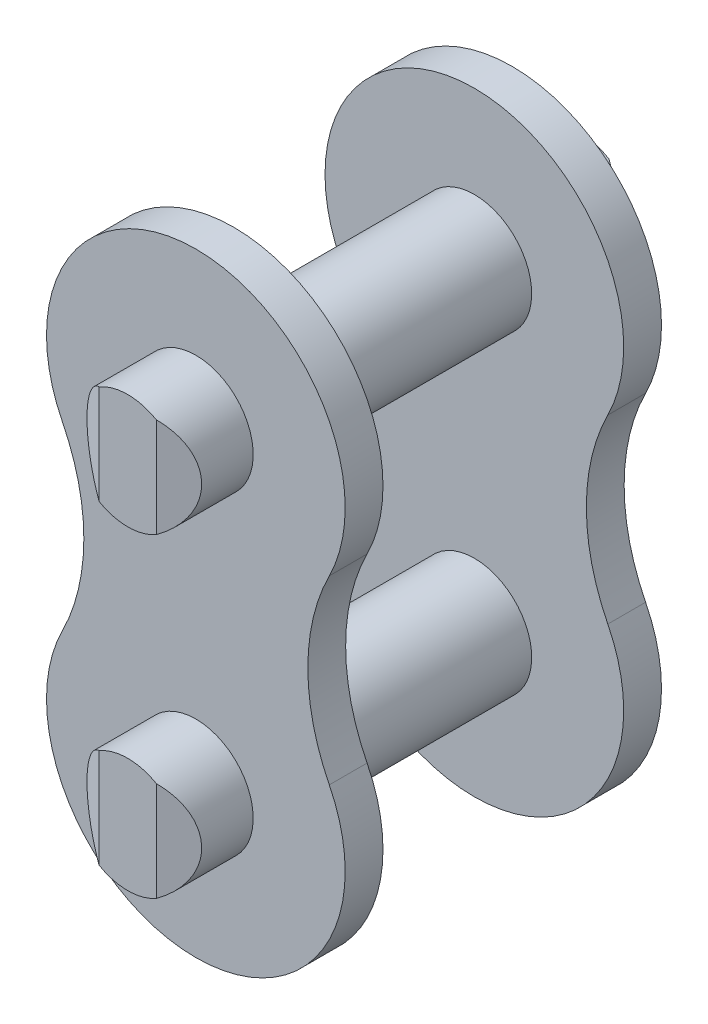
ISO-10303-21;
HEADER;
FILE_DESCRIPTION(('STEP AP214'),'2;1');
FILE_NAME('part.step','',(''),(''),'','','');
FILE_SCHEMA(('AUTOMOTIVE_DESIGN { 1 0 10303 214 1 1 1 1 }'));
ENDSEC;
DATA;
#1=APPLICATION_CONTEXT('core data for automotive mechanical design processes');
#2=APPLICATION_PROTOCOL_DEFINITION('international standard','automotive_design',2000,#1);
#3=PRODUCT_CONTEXT('',#1,'mechanical');
#4=PRODUCT('Part','Part','',(#3));
#5=PRODUCT_RELATED_PRODUCT_CATEGORY('part','',(#4));
#6=PRODUCT_DEFINITION_FORMATION('','',#4);
#7=PRODUCT_DEFINITION_CONTEXT('part definition',#1,'design');
#8=PRODUCT_DEFINITION('design','',#6,#7);
#9=PRODUCT_DEFINITION_SHAPE('','',#8);
#10=(LENGTH_UNIT() NAMED_UNIT(*) SI_UNIT(.MILLI.,.METRE.));
#11=(NAMED_UNIT(*) PLANE_ANGLE_UNIT() SI_UNIT($,.RADIAN.));
#12=(NAMED_UNIT(*) SI_UNIT($,.STERADIAN.) SOLID_ANGLE_UNIT());
#13=UNCERTAINTY_MEASURE_WITH_UNIT(LENGTH_MEASURE(1.E-05),#10,'distance_accuracy_value','');
#14=(GEOMETRIC_REPRESENTATION_CONTEXT(3) GLOBAL_UNCERTAINTY_ASSIGNED_CONTEXT((#13)) GLOBAL_UNIT_ASSIGNED_CONTEXT((#10,
#11,#12)) REPRESENTATION_CONTEXT('',''));
#15=CARTESIAN_POINT('',(0.,0.,0.));
#16=DIRECTION('',(0.,0.,1.));
#17=DIRECTION('',(1.,0.,0.));
#18=AXIS2_PLACEMENT_3D('',#15,#16,#17);
#19=CARTESIAN_POINT('',(81.9245250000065,299.467152986134,-131.392489073474));
#20=DIRECTION('',(0.5,0.,0.866025403784439));
#21=DIRECTION('',(0.,-1.,0.));
#22=AXIS2_PLACEMENT_3D('',#19,#20,#21);
#23=PLANE('',#22);
#24=CARTESIAN_POINT('',(82.7913000000066,313.969811837083,-131.892921853051));
#25=DIRECTION('',(-0.5,0.,-0.866025403784439));
#26=DIRECTION('',(-0.866025403784439,0.,0.5));
#27=AXIS2_PLACEMENT_3D('',#24,#25,#26);
#28=ELLIPSE('',#27,1.3344874122049,1.1557);
#29=CARTESIAN_POINT('',(82.2134500000065,312.968946277929,-131.5593));
#30=VERTEX_POINT('',#29);
#31=CARTESIAN_POINT('',(82.2134500000066,314.970677396236,-131.5593));
#32=VERTEX_POINT('',#31);
#33=EDGE_CURVE('E225',#30,#32,#28,.T.);
#34=ORIENTED_EDGE('',*,*,#33,.T.);
#35=DIRECTION('',(0.,1.,0.));
#36=VECTOR('',#35,1.);
#37=CARTESIAN_POINT('',(82.2134500000065,299.467152986134,-131.5593));
#38=LINE('',#37,#36);
#39=EDGE_CURVE('E206',#30,#32,#38,.T.);
#40=ORIENTED_EDGE('',*,*,#39,.F.);
#41=EDGE_LOOP('',(#34,#40));
#42=FACE_BOUND('',#41,.T.);
#43=ADVANCED_FACE('F17',(#42),#23,.F.);
#44=CARTESIAN_POINT('',(83.6580750000065,299.467152986134,-131.392489073474));
#45=DIRECTION('',(0.5,0.,-0.866025403784439));
#46=DIRECTION('',(0.,-1.,0.));
#47=AXIS2_PLACEMENT_3D('',#44,#45,#46);
#48=PLANE('',#47);
#49=CARTESIAN_POINT('',(82.7913000000066,313.969811837083,-131.892921853051));
#50=DIRECTION('',(-0.5,0.,0.866025403784439));
#51=DIRECTION('',(0.866025403784439,0.,0.5));
#52=AXIS2_PLACEMENT_3D('',#49,#50,#51);
#53=ELLIPSE('',#52,1.3344874122049,1.1557);
#54=CARTESIAN_POINT('',(83.3691500000066,312.968946277929,-131.5593));
#55=VERTEX_POINT('',#54);
#56=CARTESIAN_POINT('',(83.3691500000066,314.970677396236,-131.5593));
#57=VERTEX_POINT('',#56);
#58=EDGE_CURVE('E200',#55,#57,#53,.T.);
#59=ORIENTED_EDGE('',*,*,#58,.F.);
#60=DIRECTION('',(0.,1.,0.));
#61=VECTOR('',#60,1.);
#62=CARTESIAN_POINT('',(83.3691500000065,299.467152986134,-131.5593));
#63=LINE('',#62,#61);
#64=EDGE_CURVE('E197',#55,#57,#63,.T.);
#65=ORIENTED_EDGE('',*,*,#64,.T.);
#66=EDGE_LOOP('',(#59,#65));
#67=FACE_BOUND('',#66,.T.);
#68=ADVANCED_FACE('F19',(#67),#48,.T.);
#69=CARTESIAN_POINT('',(81.9245250000065,299.467152986134,-131.392489073474));
#70=DIRECTION('',(0.5,0.,0.866025403784439));
#71=DIRECTION('',(0.,-1.,0.));
#72=AXIS2_PLACEMENT_3D('',#69,#70,#71);
#73=PLANE('',#72);
#74=CARTESIAN_POINT('',(82.7913000000066,320.319811837083,-131.892921853051));
#75=DIRECTION('',(-0.5,0.,-0.866025403784439));
#76=DIRECTION('',(-0.866025403784439,0.,0.5));
#77=AXIS2_PLACEMENT_3D('',#74,#75,#76);
#78=ELLIPSE('',#77,1.3344874122049,1.1557);
#79=CARTESIAN_POINT('',(82.2134500000066,319.318946277929,-131.5593));
#80=VERTEX_POINT('',#79);
#81=CARTESIAN_POINT('',(82.2134500000066,321.320677396236,-131.5593));
#82=VERTEX_POINT('',#81);
#83=EDGE_CURVE('E230',#80,#82,#78,.T.);
#84=ORIENTED_EDGE('',*,*,#83,.T.);
#85=DIRECTION('',(0.,1.,0.));
#86=VECTOR('',#85,1.);
#87=CARTESIAN_POINT('',(82.2134500000065,299.467152986134,-131.5593));
#88=LINE('',#87,#86);
#89=EDGE_CURVE('E239',#80,#82,#88,.T.);
#90=ORIENTED_EDGE('',*,*,#89,.F.);
#91=EDGE_LOOP('',(#84,#90));
#92=FACE_BOUND('',#91,.T.);
#93=ADVANCED_FACE('F413',(#92),#73,.F.);
#94=CARTESIAN_POINT('',(83.6580750000065,299.467152986134,-131.392489073474));
#95=DIRECTION('',(0.5,0.,-0.866025403784439));
#96=DIRECTION('',(0.,-1.,0.));
#97=AXIS2_PLACEMENT_3D('',#94,#95,#96);
#98=PLANE('',#97);
#99=CARTESIAN_POINT('',(82.7913000000066,320.319811837083,-131.892921853051));
#100=DIRECTION('',(-0.5,0.,0.866025403784439));
#101=DIRECTION('',(0.866025403784439,0.,0.5));
#102=AXIS2_PLACEMENT_3D('',#99,#100,#101);
#103=ELLIPSE('',#102,1.3344874122049,1.1557);
#104=CARTESIAN_POINT('',(83.3691500000066,319.318946277929,-131.5593));
#105=VERTEX_POINT('',#104);
#106=CARTESIAN_POINT('',(83.3691500000066,321.320677396236,-131.5593));
#107=VERTEX_POINT('',#106);
#108=EDGE_CURVE('E252',#105,#107,#103,.T.);
#109=ORIENTED_EDGE('',*,*,#108,.F.);
#110=DIRECTION('',(0.,1.,0.));
#111=VECTOR('',#110,1.);
#112=CARTESIAN_POINT('',(83.3691500000065,299.467152986134,-131.5593));
#113=LINE('',#112,#111);
#114=EDGE_CURVE('E236',#105,#107,#113,.T.);
#115=ORIENTED_EDGE('',*,*,#114,.T.);
#116=EDGE_LOOP('',(#109,#115));
#117=FACE_BOUND('',#116,.T.);
#118=ADVANCED_FACE('F411',(#117),#98,.T.);
#119=CARTESIAN_POINT('',(82.7913000000066,317.144811837083,-129.4257));
#120=DIRECTION('',(0.,0.,-1.));
#121=DIRECTION('',(0.,-1.,0.));
#122=AXIS2_PLACEMENT_3D('',#119,#120,#121);
#123=PLANE('',#122);
#124=CARTESIAN_POINT('',(82.7913000000066,313.969811837083,-129.4257));
#125=DIRECTION('',(0.,0.,1.));
#126=DIRECTION('',(0.,1.,0.));
#127=AXIS2_PLACEMENT_3D('',#124,#125,#126);
#128=CIRCLE('',#127,1.1557);
#129=CARTESIAN_POINT('',(82.7913000000066,315.125511837082,-129.4257));
#130=VERTEX_POINT('',#129);
#131=EDGE_CURVE('E319',#130,#130,#128,.T.);
#132=ORIENTED_EDGE('',*,*,#131,.F.);
#133=EDGE_LOOP('',(#132));
#134=FACE_BOUND('',#133,.T.);
#135=CARTESIAN_POINT('',(82.7913000000066,320.319811837083,-129.4257));
#136=DIRECTION('',(0.,0.,1.));
#137=DIRECTION('',(0.,1.,0.));
#138=AXIS2_PLACEMENT_3D('',#135,#136,#137);
#139=CIRCLE('',#138,1.1557);
#140=CARTESIAN_POINT('',(82.7913000000066,321.475511837083,-129.4257));
#141=VERTEX_POINT('',#140);
#142=EDGE_CURVE('E394',#141,#141,#139,.T.);
#143=ORIENTED_EDGE('',*,*,#142,.F.);
#144=EDGE_LOOP('',(#143));
#145=FACE_BOUND('',#144,.T.);
#146=CARTESIAN_POINT('',(89.1133747362935,317.144811837083,-129.4257));
#147=DIRECTION('',(0.,0.,1.));
#148=DIRECTION('',(0.,1.,0.));
#149=AXIS2_PLACEMENT_3D('',#146,#147,#148);
#150=CIRCLE('',#149,4.06464973628698);
#151=CARTESIAN_POINT('',(85.4810560209653,318.968993360115,-129.4257));
#152=VERTEX_POINT('',#151);
#153=CARTESIAN_POINT('',(85.4810560209653,315.32063031405,-129.4257));
#154=VERTEX_POINT('',#153);
#155=EDGE_CURVE('E238',#152,#154,#150,.T.);
#156=ORIENTED_EDGE('',*,*,#155,.F.);
#157=CARTESIAN_POINT('',(82.7913000000066,320.319811837083,-129.4257));
#158=DIRECTION('',(0.,0.,1.));
#159=DIRECTION('',(0.,1.,0.));
#160=AXIS2_PLACEMENT_3D('',#157,#158,#159);
#161=CIRCLE('',#160,3.0099);
#162=CARTESIAN_POINT('',(80.1015439790478,318.968993360115,-129.4257));
#163=VERTEX_POINT('',#162);
#164=EDGE_CURVE('E247',#152,#163,#161,.T.);
#165=ORIENTED_EDGE('',*,*,#164,.T.);
#166=CARTESIAN_POINT('',(76.4692252637197,317.144811837083,-129.4257));
#167=DIRECTION('',(0.,0.,1.));
#168=DIRECTION('',(0.,1.,0.));
#169=AXIS2_PLACEMENT_3D('',#166,#167,#168);
#170=CIRCLE('',#169,4.06464973628691);
#171=CARTESIAN_POINT('',(80.1015439790478,315.32063031405,-129.4257));
#172=VERTEX_POINT('',#171);
#173=EDGE_CURVE('E263',#172,#163,#170,.T.);
#174=ORIENTED_EDGE('',*,*,#173,.F.);
#175=CARTESIAN_POINT('',(82.7913000000065,313.969811837083,-129.4257));
#176=DIRECTION('',(0.,0.,1.));
#177=DIRECTION('',(0.,1.,0.));
#178=AXIS2_PLACEMENT_3D('',#175,#176,#177);
#179=CIRCLE('',#178,3.0099);
#180=EDGE_CURVE('E26',#172,#154,#179,.T.);
#181=ORIENTED_EDGE('',*,*,#180,.T.);
#182=EDGE_LOOP('',(#156,#165,#174,#181));
#183=FACE_BOUND('',#182,.T.);
#184=ADVANCED_FACE('F277',(#134,#145,#183),#123,.F.);
#185=CARTESIAN_POINT('',(82.7913000000066,317.144811837083,-130.1877));
#186=DIRECTION('',(0.,0.,-1.));
#187=DIRECTION('',(0.,-1.,0.));
#188=AXIS2_PLACEMENT_3D('',#185,#186,#187);
#189=PLANE('',#188);
#190=CARTESIAN_POINT('',(82.7913000000066,313.969811837083,-130.1877));
#191=DIRECTION('',(0.,0.,1.));
#192=DIRECTION('',(0.,1.,0.));
#193=AXIS2_PLACEMENT_3D('',#190,#191,#192);
#194=CIRCLE('',#193,1.1557);
#195=CARTESIAN_POINT('',(82.7913000000066,315.125511837082,-130.1877));
#196=VERTEX_POINT('',#195);
#197=EDGE_CURVE('E316',#196,#196,#194,.T.);
#198=ORIENTED_EDGE('',*,*,#197,.T.);
#199=EDGE_LOOP('',(#198));
#200=FACE_BOUND('',#199,.T.);
#201=CARTESIAN_POINT('',(82.7913000000066,320.319811837083,-130.1877));
#202=DIRECTION('',(0.,0.,1.));
#203=DIRECTION('',(0.,1.,0.));
#204=AXIS2_PLACEMENT_3D('',#201,#202,#203);
#205=CIRCLE('',#204,1.1557);
#206=CARTESIAN_POINT('',(82.7913000000066,321.475511837083,-130.1877));
#207=VERTEX_POINT('',#206);
#208=EDGE_CURVE('E205',#207,#207,#205,.T.);
#209=ORIENTED_EDGE('',*,*,#208,.T.);
#210=EDGE_LOOP('',(#209));
#211=FACE_BOUND('',#210,.T.);
#212=CARTESIAN_POINT('',(89.1133747362935,317.144811837083,-130.1877));
#213=DIRECTION('',(0.,0.,1.));
#214=DIRECTION('',(0.,1.,0.));
#215=AXIS2_PLACEMENT_3D('',#212,#213,#214);
#216=CIRCLE('',#215,4.06464973628698);
#217=CARTESIAN_POINT('',(85.4810560209653,318.968993360115,-130.1877));
#218=VERTEX_POINT('',#217);
#219=CARTESIAN_POINT('',(85.4810560209653,315.32063031405,-130.1877));
#220=VERTEX_POINT('',#219);
#221=EDGE_CURVE('E248',#218,#220,#216,.T.);
#222=ORIENTED_EDGE('',*,*,#221,.T.);
#223=CARTESIAN_POINT('',(82.7913000000065,313.969811837083,-130.1877));
#224=DIRECTION('',(0.,0.,1.));
#225=DIRECTION('',(0.,1.,0.));
#226=AXIS2_PLACEMENT_3D('',#223,#224,#225);
#227=CIRCLE('',#226,3.0099);
#228=CARTESIAN_POINT('',(80.1015439790478,315.32063031405,-130.1877));
#229=VERTEX_POINT('',#228);
#230=EDGE_CURVE('E11',#229,#220,#227,.T.);
#231=ORIENTED_EDGE('',*,*,#230,.F.);
#232=CARTESIAN_POINT('',(76.4692252637197,317.144811837083,-130.1877));
#233=DIRECTION('',(0.,0.,1.));
#234=DIRECTION('',(0.,1.,0.));
#235=AXIS2_PLACEMENT_3D('',#232,#233,#234);
#236=CIRCLE('',#235,4.06464973628691);
#237=CARTESIAN_POINT('',(80.1015439790478,318.968993360115,-130.1877));
#238=VERTEX_POINT('',#237);
#239=EDGE_CURVE('E266',#229,#238,#236,.T.);
#240=ORIENTED_EDGE('',*,*,#239,.T.);
#241=CARTESIAN_POINT('',(82.7913000000066,320.319811837083,-130.1877));
#242=DIRECTION('',(0.,0.,1.));
#243=DIRECTION('',(0.,1.,0.));
#244=AXIS2_PLACEMENT_3D('',#241,#242,#243);
#245=CIRCLE('',#244,3.0099);
#246=EDGE_CURVE('E262',#218,#238,#245,.T.);
#247=ORIENTED_EDGE('',*,*,#246,.F.);
#248=EDGE_LOOP('',(#222,#231,#240,#247));
#249=FACE_BOUND('',#248,.T.);
#250=ADVANCED_FACE('F421',(#200,#211,#249),#189,.T.);
#251=CARTESIAN_POINT('',(82.7913000000065,313.969811837083,-130.1877));
#252=DIRECTION('',(0.,0.,1.));
#253=DIRECTION('',(0.,-1.,0.));
#254=AXIS2_PLACEMENT_3D('',#251,#252,#253);
#255=CYLINDRICAL_SURFACE('',#254,3.0099);
#256=ORIENTED_EDGE('',*,*,#180,.F.);
#257=DIRECTION('',(0.,0.,1.));
#258=VECTOR('',#257,1.);
#259=CARTESIAN_POINT('',(80.1015439790478,315.32063031405,-130.1877));
#260=LINE('',#259,#258);
#261=EDGE_CURVE('E270',#229,#172,#260,.T.);
#262=ORIENTED_EDGE('',*,*,#261,.F.);
#263=ORIENTED_EDGE('',*,*,#230,.T.);
#264=DIRECTION('',(0.,0.,1.));
#265=VECTOR('',#264,1.);
#266=CARTESIAN_POINT('',(85.4810560209653,315.32063031405,-130.1877));
#267=LINE('',#266,#265);
#268=EDGE_CURVE('E258',#220,#154,#267,.T.);
#269=ORIENTED_EDGE('',*,*,#268,.T.);
#270=EDGE_LOOP('',(#256,#262,#263,#269));
#271=FACE_BOUND('',#270,.T.);
#272=ADVANCED_FACE('F280',(#271),#255,.T.);
#273=CARTESIAN_POINT('',(76.4692252637197,317.144811837083,-130.1877));
#274=DIRECTION('',(0.,0.,1.));
#275=DIRECTION('',(0.,-1.,0.));
#276=AXIS2_PLACEMENT_3D('',#273,#274,#275);
#277=CYLINDRICAL_SURFACE('',#276,4.06464973628691);
#278=ORIENTED_EDGE('',*,*,#173,.T.);
#279=DIRECTION('',(0.,0.,1.));
#280=VECTOR('',#279,1.);
#281=CARTESIAN_POINT('',(80.1015439790478,318.968993360115,-130.1877));
#282=LINE('',#281,#280);
#283=EDGE_CURVE('E267',#238,#163,#282,.T.);
#284=ORIENTED_EDGE('',*,*,#283,.F.);
#285=ORIENTED_EDGE('',*,*,#239,.F.);
#286=ORIENTED_EDGE('',*,*,#261,.T.);
#287=EDGE_LOOP('',(#278,#284,#285,#286));
#288=FACE_BOUND('',#287,.T.);
#289=ADVANCED_FACE('F481',(#288),#277,.F.);
#290=CARTESIAN_POINT('',(82.7913000000066,320.319811837083,-130.1877));
#291=DIRECTION('',(0.,0.,1.));
#292=DIRECTION('',(0.,-1.,0.));
#293=AXIS2_PLACEMENT_3D('',#290,#291,#292);
#294=CYLINDRICAL_SURFACE('',#293,3.0099);
#295=ORIENTED_EDGE('',*,*,#164,.F.);
#296=DIRECTION('',(0.,0.,1.));
#297=VECTOR('',#296,1.);
#298=CARTESIAN_POINT('',(85.4810560209653,318.968993360115,-130.1877));
#299=LINE('',#298,#297);
#300=EDGE_CURVE('E243',#218,#152,#299,.T.);
#301=ORIENTED_EDGE('',*,*,#300,.F.);
#302=ORIENTED_EDGE('',*,*,#246,.T.);
#303=ORIENTED_EDGE('',*,*,#283,.T.);
#304=EDGE_LOOP('',(#295,#301,#302,#303));
#305=FACE_BOUND('',#304,.T.);
#306=ADVANCED_FACE('F493',(#305),#294,.T.);
#307=CARTESIAN_POINT('',(89.1133747362935,317.144811837083,-130.1877));
#308=DIRECTION('',(0.,0.,1.));
#309=DIRECTION('',(0.,-1.,0.));
#310=AXIS2_PLACEMENT_3D('',#307,#308,#309);
#311=CYLINDRICAL_SURFACE('',#310,4.06464973628698);
#312=ORIENTED_EDGE('',*,*,#155,.T.);
#313=ORIENTED_EDGE('',*,*,#268,.F.);
#314=ORIENTED_EDGE('',*,*,#221,.F.);
#315=ORIENTED_EDGE('',*,*,#300,.T.);
#316=EDGE_LOOP('',(#312,#313,#314,#315));
#317=FACE_BOUND('',#316,.T.);
#318=ADVANCED_FACE('F285',(#317),#311,.F.);
#319=CARTESIAN_POINT('',(82.7913000000066,317.144811837083,-131.5593));
#320=DIRECTION('',(0.,0.,-1.));
#321=DIRECTION('',(0.,-1.,0.));
#322=AXIS2_PLACEMENT_3D('',#319,#320,#321);
#323=PLANE('',#322);
#324=ORIENTED_EDGE('',*,*,#89,.T.);
#325=CARTESIAN_POINT('',(82.7913000000066,320.319811837083,-131.5593));
#326=DIRECTION('',(0.,0.,1.));
#327=DIRECTION('',(0.,1.,0.));
#328=AXIS2_PLACEMENT_3D('',#325,#326,#327);
#329=CIRCLE('',#328,1.1557);
#330=EDGE_CURVE('E251',#107,#82,#329,.T.);
#331=ORIENTED_EDGE('',*,*,#330,.F.);
#332=ORIENTED_EDGE('',*,*,#114,.F.);
#333=CARTESIAN_POINT('',(82.7913000000066,320.319811837083,-131.5593));
#334=DIRECTION('',(0.,0.,1.));
#335=DIRECTION('',(0.,1.,0.));
#336=AXIS2_PLACEMENT_3D('',#333,#334,#335);
#337=CIRCLE('',#336,1.1557);
#338=EDGE_CURVE('E233',#80,#105,#337,.T.);
#339=ORIENTED_EDGE('',*,*,#338,.F.);
#340=EDGE_LOOP('',(#324,#331,#332,#339));
#341=FACE_BOUND('',#340,.T.);
#342=ADVANCED_FACE('F408',(#341),#323,.T.);
#343=CARTESIAN_POINT('',(82.7913000000066,320.319811837083,-131.5593));
#344=DIRECTION('',(0.,0.,1.));
#345=DIRECTION('',(0.,-1.,0.));
#346=AXIS2_PLACEMENT_3D('',#343,#344,#345);
#347=CYLINDRICAL_SURFACE('',#346,1.1557);
#348=ORIENTED_EDGE('',*,*,#83,.F.);
#349=ORIENTED_EDGE('',*,*,#338,.T.);
#350=ORIENTED_EDGE('',*,*,#108,.T.);
#351=ORIENTED_EDGE('',*,*,#330,.T.);
#352=EDGE_LOOP('',(#348,#349,#350,#351));
#353=FACE_BOUND('',#352,.T.);
#354=ORIENTED_EDGE('',*,*,#208,.F.);
#355=EDGE_LOOP('',(#354));
#356=FACE_BOUND('',#355,.T.);
#357=ADVANCED_FACE('F404',(#353,#356),#347,.T.);
#358=CARTESIAN_POINT('',(82.7913000000066,317.144811837083,-131.5593));
#359=DIRECTION('',(0.,0.,-1.));
#360=DIRECTION('',(0.,-1.,0.));
#361=AXIS2_PLACEMENT_3D('',#358,#359,#360);
#362=PLANE('',#361);
#363=ORIENTED_EDGE('',*,*,#39,.T.);
#364=CARTESIAN_POINT('',(82.7913000000066,313.969811837083,-131.5593));
#365=DIRECTION('',(0.,0.,1.));
#366=DIRECTION('',(0.,1.,0.));
#367=AXIS2_PLACEMENT_3D('',#364,#365,#366);
#368=CIRCLE('',#367,1.1557);
#369=EDGE_CURVE('E209',#57,#32,#368,.T.);
#370=ORIENTED_EDGE('',*,*,#369,.F.);
#371=ORIENTED_EDGE('',*,*,#64,.F.);
#372=CARTESIAN_POINT('',(82.7913000000066,313.969811837083,-131.5593));
#373=DIRECTION('',(0.,0.,1.));
#374=DIRECTION('',(0.,1.,0.));
#375=AXIS2_PLACEMENT_3D('',#372,#373,#374);
#376=CIRCLE('',#375,1.1557);
#377=EDGE_CURVE('E218',#30,#55,#376,.T.);
#378=ORIENTED_EDGE('',*,*,#377,.F.);
#379=EDGE_LOOP('',(#363,#370,#371,#378));
#380=FACE_BOUND('',#379,.T.);
#381=ADVANCED_FACE('F210',(#380),#362,.T.);
#382=CARTESIAN_POINT('',(82.7913000000066,313.969811837083,-131.5593));
#383=DIRECTION('',(0.,0.,1.));
#384=DIRECTION('',(0.,-1.,0.));
#385=AXIS2_PLACEMENT_3D('',#382,#383,#384);
#386=CYLINDRICAL_SURFACE('',#385,1.1557);
#387=ORIENTED_EDGE('',*,*,#33,.F.);
#388=ORIENTED_EDGE('',*,*,#377,.T.);
#389=ORIENTED_EDGE('',*,*,#58,.T.);
#390=ORIENTED_EDGE('',*,*,#369,.T.);
#391=EDGE_LOOP('',(#387,#388,#389,#390));
#392=FACE_BOUND('',#391,.T.);
#393=ORIENTED_EDGE('',*,*,#197,.F.);
#394=EDGE_LOOP('',(#393));
#395=FACE_BOUND('',#394,.T.);
#396=ADVANCED_FACE('F216',(#392,#395),#386,.T.);
#397=CARTESIAN_POINT('',(81.9245250000065,299.467152986134,-122.607510926526));
#398=DIRECTION('',(0.5,0.,-0.866025403784439));
#399=DIRECTION('',(0.,-1.,0.));
#400=AXIS2_PLACEMENT_3D('',#397,#398,#399);
#401=PLANE('',#400);
#402=CARTESIAN_POINT('',(82.7913000000066,313.969811837083,-122.107078146949));
#403=DIRECTION('',(0.5,0.,-0.866025403784439));
#404=DIRECTION('',(-0.866025403784439,0.,-0.5));
#405=AXIS2_PLACEMENT_3D('',#402,#403,#404);
#406=ELLIPSE('',#405,1.3344874122049,1.1557);
#407=CARTESIAN_POINT('',(82.2134500000065,312.968946277929,-122.4407));
#408=VERTEX_POINT('',#407);
#409=CARTESIAN_POINT('',(82.2134500000066,314.970677396236,-122.4407));
#410=VERTEX_POINT('',#409);
#411=EDGE_CURVE('E728',#408,#410,#406,.T.);
#412=ORIENTED_EDGE('',*,*,#411,.F.);
#413=DIRECTION('',(0.,1.,0.));
#414=VECTOR('',#413,1.);
#415=CARTESIAN_POINT('',(82.2134500000065,299.467152986134,-122.4407));
#416=LINE('',#415,#414);
#417=EDGE_CURVE('E303',#408,#410,#416,.T.);
#418=ORIENTED_EDGE('',*,*,#417,.T.);
#419=EDGE_LOOP('',(#412,#418));
#420=FACE_BOUND('',#419,.T.);
#421=ADVANCED_FACE('F549',(#420),#401,.F.);
#422=CARTESIAN_POINT('',(83.6580750000065,299.467152986134,-122.607510926526));
#423=DIRECTION('',(0.5,0.,0.866025403784439));
#424=DIRECTION('',(0.,-1.,0.));
#425=AXIS2_PLACEMENT_3D('',#422,#423,#424);
#426=PLANE('',#425);
#427=CARTESIAN_POINT('',(82.7913000000066,313.969811837083,-122.107078146949));
#428=DIRECTION('',(0.5,0.,0.866025403784439));
#429=DIRECTION('',(0.866025403784439,0.,-0.5));
#430=AXIS2_PLACEMENT_3D('',#427,#428,#429);
#431=ELLIPSE('',#430,1.3344874122049,1.1557);
#432=CARTESIAN_POINT('',(83.3691500000066,312.968946277929,-122.4407));
#433=VERTEX_POINT('',#432);
#434=CARTESIAN_POINT('',(83.3691500000066,314.970677396236,-122.4407));
#435=VERTEX_POINT('',#434);
#436=EDGE_CURVE('E296',#433,#435,#431,.T.);
#437=ORIENTED_EDGE('',*,*,#436,.T.);
#438=DIRECTION('',(0.,1.,0.));
#439=VECTOR('',#438,1.);
#440=CARTESIAN_POINT('',(83.3691500000065,299.467152986134,-122.4407));
#441=LINE('',#440,#439);
#442=EDGE_CURVE('E306',#433,#435,#441,.T.);
#443=ORIENTED_EDGE('',*,*,#442,.F.);
#444=EDGE_LOOP('',(#437,#443));
#445=FACE_BOUND('',#444,.T.);
#446=ADVANCED_FACE('F559',(#445),#426,.T.);
#447=CARTESIAN_POINT('',(81.9245250000065,299.467152986134,-122.607510926526));
#448=DIRECTION('',(0.5,0.,-0.866025403784439));
#449=DIRECTION('',(0.,-1.,0.));
#450=AXIS2_PLACEMENT_3D('',#447,#448,#449);
#451=PLANE('',#450);
#452=CARTESIAN_POINT('',(82.7913000000066,320.319811837083,-122.107078146949));
#453=DIRECTION('',(0.5,0.,-0.866025403784439));
#454=DIRECTION('',(-0.866025403784439,0.,-0.5));
#455=AXIS2_PLACEMENT_3D('',#452,#453,#454);
#456=ELLIPSE('',#455,1.3344874122049,1.1557);
#457=CARTESIAN_POINT('',(82.2134500000066,319.318946277929,-122.4407));
#458=VERTEX_POINT('',#457);
#459=CARTESIAN_POINT('',(82.2134500000066,321.320677396236,-122.4407));
#460=VERTEX_POINT('',#459);
#461=EDGE_CURVE('E312',#458,#460,#456,.T.);
#462=ORIENTED_EDGE('',*,*,#461,.F.);
#463=DIRECTION('',(0.,1.,0.));
#464=VECTOR('',#463,1.);
#465=CARTESIAN_POINT('',(82.2134500000065,299.467152986134,-122.4407));
#466=LINE('',#465,#464);
#467=EDGE_CURVE('E344',#458,#460,#466,.T.);
#468=ORIENTED_EDGE('',*,*,#467,.T.);
#469=EDGE_LOOP('',(#462,#468));
#470=FACE_BOUND('',#469,.T.);
#471=ADVANCED_FACE('F570',(#470),#451,.F.);
#472=CARTESIAN_POINT('',(83.6580750000065,299.467152986134,-122.607510926526));
#473=DIRECTION('',(0.5,0.,0.866025403784439));
#474=DIRECTION('',(0.,-1.,0.));
#475=AXIS2_PLACEMENT_3D('',#472,#473,#474);
#476=PLANE('',#475);
#477=CARTESIAN_POINT('',(82.7913000000066,320.319811837083,-122.107078146949));
#478=DIRECTION('',(0.5,0.,0.866025403784439));
#479=DIRECTION('',(0.866025403784439,0.,-0.5));
#480=AXIS2_PLACEMENT_3D('',#477,#478,#479);
#481=ELLIPSE('',#480,1.3344874122049,1.1557);
#482=CARTESIAN_POINT('',(83.3691500000066,319.318946277929,-122.4407));
#483=VERTEX_POINT('',#482);
#484=CARTESIAN_POINT('',(83.3691500000066,321.320677396236,-122.4407));
#485=VERTEX_POINT('',#484);
#486=EDGE_CURVE('E320',#483,#485,#481,.T.);
#487=ORIENTED_EDGE('',*,*,#486,.T.);
#488=DIRECTION('',(0.,1.,0.));
#489=VECTOR('',#488,1.);
#490=CARTESIAN_POINT('',(83.3691500000065,299.467152986134,-122.4407));
#491=LINE('',#490,#489);
#492=EDGE_CURVE('E348',#483,#485,#491,.T.);
#493=ORIENTED_EDGE('',*,*,#492,.F.);
#494=EDGE_LOOP('',(#487,#493));
#495=FACE_BOUND('',#494,.T.);
#496=ADVANCED_FACE('F579',(#495),#476,.T.);
#497=CARTESIAN_POINT('',(82.7913000000066,313.969811837083,-122.4407));
#498=DIRECTION('',(0.,0.,-1.));
#499=DIRECTION('',(0.,-1.,0.));
#500=AXIS2_PLACEMENT_3D('',#497,#498,#499);
#501=CYLINDRICAL_SURFACE('',#500,1.1557);
#502=ORIENTED_EDGE('',*,*,#131,.T.);
#503=EDGE_LOOP('',(#502));
#504=FACE_BOUND('',#503,.T.);
#505=CARTESIAN_POINT('',(82.7913000000066,313.969811837083,-124.5743));
#506=DIRECTION('',(0.,0.,1.));
#507=DIRECTION('',(0.,1.,0.));
#508=AXIS2_PLACEMENT_3D('',#505,#506,#507);
#509=CIRCLE('',#508,1.1557);
#510=CARTESIAN_POINT('',(82.7913000000066,315.125511837082,-124.5743));
#511=VERTEX_POINT('',#510);
#512=EDGE_CURVE('E391',#511,#511,#509,.T.);
#513=ORIENTED_EDGE('',*,*,#512,.F.);
#514=EDGE_LOOP('',(#513));
#515=FACE_BOUND('',#514,.T.);
#516=ADVANCED_FACE('F588',(#504,#515),#501,.T.);
#517=CARTESIAN_POINT('',(82.7913000000066,320.319811837083,-122.4407));
#518=DIRECTION('',(0.,0.,-1.));
#519=DIRECTION('',(0.,-1.,0.));
#520=AXIS2_PLACEMENT_3D('',#517,#518,#519);
#521=CYLINDRICAL_SURFACE('',#520,1.1557);
#522=ORIENTED_EDGE('',*,*,#142,.T.);
#523=EDGE_LOOP('',(#522));
#524=FACE_BOUND('',#523,.T.);
#525=CARTESIAN_POINT('',(82.7913000000066,320.319811837083,-124.5743));
#526=DIRECTION('',(0.,0.,1.));
#527=DIRECTION('',(0.,1.,0.));
#528=AXIS2_PLACEMENT_3D('',#525,#526,#527);
#529=CIRCLE('',#528,1.1557);
#530=CARTESIAN_POINT('',(82.7913000000066,321.475511837083,-124.5743));
#531=VERTEX_POINT('',#530);
#532=EDGE_CURVE('E388',#531,#531,#529,.T.);
#533=ORIENTED_EDGE('',*,*,#532,.F.);
#534=EDGE_LOOP('',(#533));
#535=FACE_BOUND('',#534,.T.);
#536=ADVANCED_FACE('F599',(#524,#535),#521,.T.);
#537=CARTESIAN_POINT('',(82.7913000000066,317.144811837083,-124.5743));
#538=DIRECTION('',(0.,0.,1.));
#539=DIRECTION('',(1.,0.,0.));
#540=AXIS2_PLACEMENT_3D('',#537,#538,#539);
#541=PLANE('',#540);
#542=ORIENTED_EDGE('',*,*,#512,.T.);
#543=EDGE_LOOP('',(#542));
#544=FACE_BOUND('',#543,.T.);
#545=ORIENTED_EDGE('',*,*,#532,.T.);
#546=EDGE_LOOP('',(#545));
#547=FACE_BOUND('',#546,.T.);
#548=CARTESIAN_POINT('',(89.1133747362935,317.144811837083,-124.5743));
#549=DIRECTION('',(0.,0.,1.));
#550=DIRECTION('',(0.,1.,0.));
#551=AXIS2_PLACEMENT_3D('',#548,#549,#550);
#552=CIRCLE('',#551,4.06464973628698);
#553=CARTESIAN_POINT('',(85.4810560209653,318.968993360115,-124.5743));
#554=VERTEX_POINT('',#553);
#555=CARTESIAN_POINT('',(85.4810560209653,315.32063031405,-124.5743));
#556=VERTEX_POINT('',#555);
#557=EDGE_CURVE('E334',#554,#556,#552,.T.);
#558=ORIENTED_EDGE('',*,*,#557,.T.);
#559=CARTESIAN_POINT('',(82.7913000000065,313.969811837083,-124.5743));
#560=DIRECTION('',(0.,0.,1.));
#561=DIRECTION('',(0.,1.,0.));
#562=AXIS2_PLACEMENT_3D('',#559,#560,#561);
#563=CIRCLE('',#562,3.0099);
#564=CARTESIAN_POINT('',(80.1015439790478,315.32063031405,-124.5743));
#565=VERTEX_POINT('',#564);
#566=EDGE_CURVE('E381',#565,#556,#563,.T.);
#567=ORIENTED_EDGE('',*,*,#566,.F.);
#568=CARTESIAN_POINT('',(76.4692252637197,317.144811837083,-124.5743));
#569=DIRECTION('',(0.,0.,1.));
#570=DIRECTION('',(0.,1.,0.));
#571=AXIS2_PLACEMENT_3D('',#568,#569,#570);
#572=CIRCLE('',#571,4.06464973628691);
#573=CARTESIAN_POINT('',(80.1015439790478,318.968993360115,-124.5743));
#574=VERTEX_POINT('',#573);
#575=EDGE_CURVE('E362',#565,#574,#572,.T.);
#576=ORIENTED_EDGE('',*,*,#575,.T.);
#577=CARTESIAN_POINT('',(82.7913000000066,320.319811837083,-124.5743));
#578=DIRECTION('',(0.,0.,1.));
#579=DIRECTION('',(0.,1.,0.));
#580=AXIS2_PLACEMENT_3D('',#577,#578,#579);
#581=CIRCLE('',#580,3.0099);
#582=EDGE_CURVE('E340',#554,#574,#581,.T.);
#583=ORIENTED_EDGE('',*,*,#582,.F.);
#584=EDGE_LOOP('',(#558,#567,#576,#583));
#585=FACE_BOUND('',#584,.T.);
#586=ADVANCED_FACE('F610',(#544,#547,#585),#541,.F.);
#587=CARTESIAN_POINT('',(82.7913000000066,317.144811837083,-123.8123));
#588=DIRECTION('',(0.,0.,1.));
#589=DIRECTION('',(1.,0.,0.));
#590=AXIS2_PLACEMENT_3D('',#587,#588,#589);
#591=PLANE('',#590);
#592=CARTESIAN_POINT('',(82.7913000000066,313.969811837083,-123.8123));
#593=DIRECTION('',(0.,0.,1.));
#594=DIRECTION('',(0.,1.,0.));
#595=AXIS2_PLACEMENT_3D('',#592,#593,#594);
#596=CIRCLE('',#595,1.1557);
#597=CARTESIAN_POINT('',(82.7913000000066,315.125511837082,-123.8123));
#598=VERTEX_POINT('',#597);
#599=EDGE_CURVE('E730',#598,#598,#596,.T.);
#600=ORIENTED_EDGE('',*,*,#599,.F.);
#601=EDGE_LOOP('',(#600));
#602=FACE_BOUND('',#601,.T.);
#603=CARTESIAN_POINT('',(82.7913000000066,320.319811837083,-123.8123));
#604=DIRECTION('',(0.,0.,1.));
#605=DIRECTION('',(0.,1.,0.));
#606=AXIS2_PLACEMENT_3D('',#603,#604,#605);
#607=CIRCLE('',#606,1.1557);
#608=CARTESIAN_POINT('',(82.7913000000066,321.475511837083,-123.8123));
#609=VERTEX_POINT('',#608);
#610=EDGE_CURVE('E309',#609,#609,#607,.T.);
#611=ORIENTED_EDGE('',*,*,#610,.F.);
#612=EDGE_LOOP('',(#611));
#613=FACE_BOUND('',#612,.T.);
#614=CARTESIAN_POINT('',(89.1133747362935,317.144811837083,-123.8123));
#615=DIRECTION('',(0.,0.,1.));
#616=DIRECTION('',(0.,1.,0.));
#617=AXIS2_PLACEMENT_3D('',#614,#615,#616);
#618=CIRCLE('',#617,4.06464973628698);
#619=CARTESIAN_POINT('',(85.4810560209653,318.968993360115,-123.8123));
#620=VERTEX_POINT('',#619);
#621=CARTESIAN_POINT('',(85.4810560209653,315.32063031405,-123.8123));
#622=VERTEX_POINT('',#621);
#623=EDGE_CURVE('E333',#620,#622,#618,.T.);
#624=ORIENTED_EDGE('',*,*,#623,.F.);
#625=CARTESIAN_POINT('',(82.7913000000066,320.319811837083,-123.8123));
#626=DIRECTION('',(0.,0.,1.));
#627=DIRECTION('',(0.,1.,0.));
#628=AXIS2_PLACEMENT_3D('',#625,#626,#627);
#629=CIRCLE('',#628,3.0099);
#630=CARTESIAN_POINT('',(80.1015439790478,318.968993360115,-123.8123));
#631=VERTEX_POINT('',#630);
#632=EDGE_CURVE('E339',#620,#631,#629,.T.);
#633=ORIENTED_EDGE('',*,*,#632,.T.);
#634=CARTESIAN_POINT('',(76.4692252637197,317.144811837083,-123.8123));
#635=DIRECTION('',(0.,0.,1.));
#636=DIRECTION('',(0.,1.,0.));
#637=AXIS2_PLACEMENT_3D('',#634,#635,#636);
#638=CIRCLE('',#637,4.06464973628691);
#639=CARTESIAN_POINT('',(80.1015439790478,315.32063031405,-123.8123));
#640=VERTEX_POINT('',#639);
#641=EDGE_CURVE('E379',#640,#631,#638,.T.);
#642=ORIENTED_EDGE('',*,*,#641,.F.);
#643=CARTESIAN_POINT('',(82.7913000000065,313.969811837083,-123.8123));
#644=DIRECTION('',(0.,0.,1.));
#645=DIRECTION('',(0.,1.,0.));
#646=AXIS2_PLACEMENT_3D('',#643,#644,#645);
#647=CIRCLE('',#646,3.0099);
#648=EDGE_CURVE('E385',#640,#622,#647,.T.);
#649=ORIENTED_EDGE('',*,*,#648,.T.);
#650=EDGE_LOOP('',(#624,#633,#642,#649));
#651=FACE_BOUND('',#650,.T.);
#652=ADVANCED_FACE('F621',(#602,#613,#651),#591,.T.);
#653=CARTESIAN_POINT('',(82.7913000000065,313.969811837083,-123.8123));
#654=DIRECTION('',(0.,0.,-1.));
#655=DIRECTION('',(0.,-1.,0.));
#656=AXIS2_PLACEMENT_3D('',#653,#654,#655);
#657=CYLINDRICAL_SURFACE('',#656,3.0099);
#658=ORIENTED_EDGE('',*,*,#566,.T.);
#659=DIRECTION('',(0.,0.,-1.));
#660=VECTOR('',#659,1.);
#661=CARTESIAN_POINT('',(85.4810560209653,315.32063031405,-123.8123));
#662=LINE('',#661,#660);
#663=EDGE_CURVE('E366',#622,#556,#662,.T.);
#664=ORIENTED_EDGE('',*,*,#663,.F.);
#665=ORIENTED_EDGE('',*,*,#648,.F.);
#666=DIRECTION('',(0.,0.,-1.));
#667=VECTOR('',#666,1.);
#668=CARTESIAN_POINT('',(80.1015439790478,315.32063031405,-123.8123));
#669=LINE('',#668,#667);
#670=EDGE_CURVE('E375',#640,#565,#669,.T.);
#671=ORIENTED_EDGE('',*,*,#670,.T.);
#672=EDGE_LOOP('',(#658,#664,#665,#671));
#673=FACE_BOUND('',#672,.T.);
#674=ADVANCED_FACE('F631',(#673),#657,.T.);
#675=CARTESIAN_POINT('',(76.4692252637197,317.144811837083,-123.8123));
#676=DIRECTION('',(0.,0.,-1.));
#677=DIRECTION('',(0.,-1.,0.));
#678=AXIS2_PLACEMENT_3D('',#675,#676,#677);
#679=CYLINDRICAL_SURFACE('',#678,4.06464973628691);
#680=ORIENTED_EDGE('',*,*,#575,.F.);
#681=ORIENTED_EDGE('',*,*,#670,.F.);
#682=ORIENTED_EDGE('',*,*,#641,.T.);
#683=DIRECTION('',(0.,0.,-1.));
#684=VECTOR('',#683,1.);
#685=CARTESIAN_POINT('',(80.1015439790478,318.968993360115,-123.8123));
#686=LINE('',#685,#684);
#687=EDGE_CURVE('E335',#631,#574,#686,.T.);
#688=ORIENTED_EDGE('',*,*,#687,.T.);
#689=EDGE_LOOP('',(#680,#681,#682,#688));
#690=FACE_BOUND('',#689,.T.);
#691=ADVANCED_FACE('F642',(#690),#679,.F.);
#692=CARTESIAN_POINT('',(82.7913000000066,320.319811837083,-123.8123));
#693=DIRECTION('',(0.,0.,-1.));
#694=DIRECTION('',(0.,-1.,0.));
#695=AXIS2_PLACEMENT_3D('',#692,#693,#694);
#696=CYLINDRICAL_SURFACE('',#695,3.0099);
#697=ORIENTED_EDGE('',*,*,#582,.T.);
#698=ORIENTED_EDGE('',*,*,#687,.F.);
#699=ORIENTED_EDGE('',*,*,#632,.F.);
#700=DIRECTION('',(0.,0.,-1.));
#701=VECTOR('',#700,1.);
#702=CARTESIAN_POINT('',(85.4810560209653,318.968993360115,-123.8123));
#703=LINE('',#702,#701);
#704=EDGE_CURVE('E329',#620,#554,#703,.T.);
#705=ORIENTED_EDGE('',*,*,#704,.T.);
#706=EDGE_LOOP('',(#697,#698,#699,#705));
#707=FACE_BOUND('',#706,.T.);
#708=ADVANCED_FACE('F654',(#707),#696,.T.);
#709=CARTESIAN_POINT('',(89.1133747362935,317.144811837083,-123.8123));
#710=DIRECTION('',(0.,0.,-1.));
#711=DIRECTION('',(0.,-1.,0.));
#712=AXIS2_PLACEMENT_3D('',#709,#710,#711);
#713=CYLINDRICAL_SURFACE('',#712,4.06464973628698);
#714=ORIENTED_EDGE('',*,*,#557,.F.);
#715=ORIENTED_EDGE('',*,*,#704,.F.);
#716=ORIENTED_EDGE('',*,*,#623,.T.);
#717=ORIENTED_EDGE('',*,*,#663,.T.);
#718=EDGE_LOOP('',(#714,#715,#716,#717));
#719=FACE_BOUND('',#718,.T.);
#720=ADVANCED_FACE('F667',(#719),#713,.F.);
#721=CARTESIAN_POINT('',(82.7913000000066,317.144811837083,-122.4407));
#722=DIRECTION('',(0.,0.,1.));
#723=DIRECTION('',(1.,0.,0.));
#724=AXIS2_PLACEMENT_3D('',#721,#722,#723);
#725=PLANE('',#724);
#726=ORIENTED_EDGE('',*,*,#467,.F.);
#727=CARTESIAN_POINT('',(82.7913000000066,320.319811837083,-122.4407));
#728=DIRECTION('',(0.,0.,1.));
#729=DIRECTION('',(0.,1.,0.));
#730=AXIS2_PLACEMENT_3D('',#727,#728,#729);
#731=CIRCLE('',#730,1.1557);
#732=EDGE_CURVE('E324',#458,#483,#731,.T.);
#733=ORIENTED_EDGE('',*,*,#732,.T.);
#734=ORIENTED_EDGE('',*,*,#492,.T.);
#735=CARTESIAN_POINT('',(82.7913000000066,320.319811837083,-122.4407));
#736=DIRECTION('',(0.,0.,1.));
#737=DIRECTION('',(0.,1.,0.));
#738=AXIS2_PLACEMENT_3D('',#735,#736,#737);
#739=CIRCLE('',#738,1.1557);
#740=EDGE_CURVE('E325',#485,#460,#739,.T.);
#741=ORIENTED_EDGE('',*,*,#740,.T.);
#742=EDGE_LOOP('',(#726,#733,#734,#741));
#743=FACE_BOUND('',#742,.T.);
#744=ADVANCED_FACE('F679',(#743),#725,.T.);
#745=CARTESIAN_POINT('',(82.7913000000066,320.319811837083,-122.4407));
#746=DIRECTION('',(0.,0.,-1.));
#747=DIRECTION('',(0.,-1.,0.));
#748=AXIS2_PLACEMENT_3D('',#745,#746,#747);
#749=CYLINDRICAL_SURFACE('',#748,1.1557);
#750=ORIENTED_EDGE('',*,*,#461,.T.);
#751=ORIENTED_EDGE('',*,*,#740,.F.);
#752=ORIENTED_EDGE('',*,*,#486,.F.);
#753=ORIENTED_EDGE('',*,*,#732,.F.);
#754=EDGE_LOOP('',(#750,#751,#752,#753));
#755=FACE_BOUND('',#754,.T.);
#756=ORIENTED_EDGE('',*,*,#610,.T.);
#757=EDGE_LOOP('',(#756));
#758=FACE_BOUND('',#757,.T.);
#759=ADVANCED_FACE('F689',(#755,#758),#749,.T.);
#760=CARTESIAN_POINT('',(82.7913000000066,317.144811837083,-122.4407));
#761=DIRECTION('',(0.,0.,1.));
#762=DIRECTION('',(1.,0.,0.));
#763=AXIS2_PLACEMENT_3D('',#760,#761,#762);
#764=PLANE('',#763);
#765=ORIENTED_EDGE('',*,*,#417,.F.);
#766=CARTESIAN_POINT('',(82.7913000000066,313.969811837083,-122.4407));
#767=DIRECTION('',(0.,0.,1.));
#768=DIRECTION('',(0.,1.,0.));
#769=AXIS2_PLACEMENT_3D('',#766,#767,#768);
#770=CIRCLE('',#769,1.1557);
#771=EDGE_CURVE('E299',#408,#433,#770,.T.);
#772=ORIENTED_EDGE('',*,*,#771,.T.);
#773=ORIENTED_EDGE('',*,*,#442,.T.);
#774=CARTESIAN_POINT('',(82.7913000000066,313.969811837083,-122.4407));
#775=DIRECTION('',(0.,0.,1.));
#776=DIRECTION('',(0.,1.,0.));
#777=AXIS2_PLACEMENT_3D('',#774,#775,#776);
#778=CIRCLE('',#777,1.1557);
#779=EDGE_CURVE('E294',#435,#410,#778,.T.);
#780=ORIENTED_EDGE('',*,*,#779,.T.);
#781=EDGE_LOOP('',(#765,#772,#773,#780));
#782=FACE_BOUND('',#781,.T.);
#783=ADVANCED_FACE('F699',(#782),#764,.T.);
#784=CARTESIAN_POINT('',(82.7913000000066,313.969811837083,-122.4407));
#785=DIRECTION('',(0.,0.,-1.));
#786=DIRECTION('',(0.,-1.,0.));
#787=AXIS2_PLACEMENT_3D('',#784,#785,#786);
#788=CYLINDRICAL_SURFACE('',#787,1.1557);
#789=ORIENTED_EDGE('',*,*,#411,.T.);
#790=ORIENTED_EDGE('',*,*,#779,.F.);
#791=ORIENTED_EDGE('',*,*,#436,.F.);
#792=ORIENTED_EDGE('',*,*,#771,.F.);
#793=EDGE_LOOP('',(#789,#790,#791,#792));
#794=FACE_BOUND('',#793,.T.);
#795=ORIENTED_EDGE('',*,*,#599,.T.);
#796=EDGE_LOOP('',(#795));
#797=FACE_BOUND('',#796,.T.);
#798=ADVANCED_FACE('F709',(#794,#797),#788,.T.);
#799=CLOSED_SHELL('',(#43,#68,#93,#118,#184,#250,#272,#289,#306,#318,#342,#357,#381,#396,#421,
#446,#471,#496,#516,#536,#586,#652,#674,#691,#708,#720,#744,#759,#783,#798));
#800=MANIFOLD_SOLID_BREP('B1',#799);
#801=ADVANCED_BREP_SHAPE_REPRESENTATION('',(#18,#800),#14);
#802=SHAPE_DEFINITION_REPRESENTATION(#9,#801);
ENDSEC;
END-ISO-10303-21;
